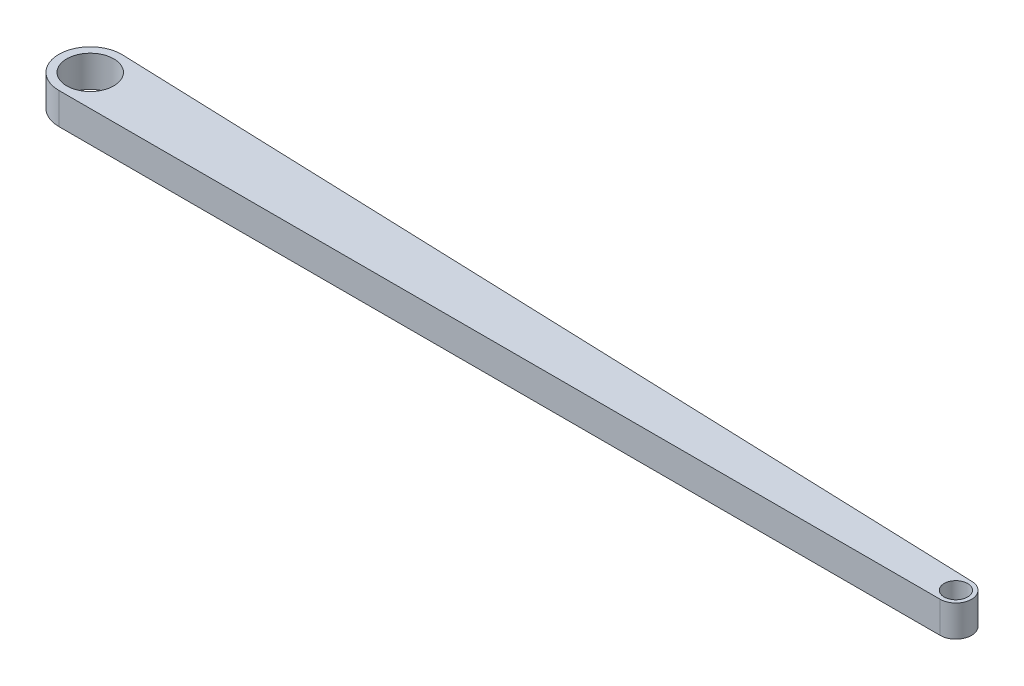
ISO-10303-21;
HEADER;
FILE_DESCRIPTION(('STEP AP214'),'2;1');
FILE_NAME('part.step','',(''),(''),'','','');
FILE_SCHEMA(('AUTOMOTIVE_DESIGN { 1 0 10303 214 1 1 1 1 }'));
ENDSEC;
DATA;
#1=APPLICATION_CONTEXT('core data for automotive mechanical design processes');
#2=APPLICATION_PROTOCOL_DEFINITION('international standard','automotive_design',2000,#1);
#3=PRODUCT_CONTEXT('',#1,'mechanical');
#4=PRODUCT('Part','Part','',(#3));
#5=PRODUCT_RELATED_PRODUCT_CATEGORY('part','',(#4));
#6=PRODUCT_DEFINITION_FORMATION('','',#4);
#7=PRODUCT_DEFINITION_CONTEXT('part definition',#1,'design');
#8=PRODUCT_DEFINITION('design','',#6,#7);
#9=PRODUCT_DEFINITION_SHAPE('','',#8);
#10=(LENGTH_UNIT() NAMED_UNIT(*) SI_UNIT(.MILLI.,.METRE.));
#11=(NAMED_UNIT(*) PLANE_ANGLE_UNIT() SI_UNIT($,.RADIAN.));
#12=(NAMED_UNIT(*) SI_UNIT($,.STERADIAN.) SOLID_ANGLE_UNIT());
#13=UNCERTAINTY_MEASURE_WITH_UNIT(LENGTH_MEASURE(1.E-05),#10,'distance_accuracy_value','');
#14=(GEOMETRIC_REPRESENTATION_CONTEXT(3) GLOBAL_UNCERTAINTY_ASSIGNED_CONTEXT((#13)) GLOBAL_UNIT_ASSIGNED_CONTEXT((#10,
#11,#12)) REPRESENTATION_CONTEXT('',''));
#15=CARTESIAN_POINT('',(0.,0.,0.));
#16=DIRECTION('',(0.,0.,1.));
#17=DIRECTION('',(1.,0.,0.));
#18=AXIS2_PLACEMENT_3D('',#15,#16,#17);
#19=CARTESIAN_POINT('',(1800.,64.,-32.));
#20=DIRECTION('',(0.,-1.,0.));
#21=DIRECTION('',(0.,0.,-1.));
#22=AXIS2_PLACEMENT_3D('',#19,#20,#21);
#23=CYLINDRICAL_SURFACE('',#22,31.9999999999999);
#24=CARTESIAN_POINT('',(1800.,0.,-32.));
#25=DIRECTION('',(0.,1.,0.));
#26=DIRECTION('',(0.,0.,1.));
#27=AXIS2_PLACEMENT_3D('',#24,#25,#26);
#28=CIRCLE('',#27,31.9999999999999);
#29=CARTESIAN_POINT('',(1800.,0.,0.));
#30=VERTEX_POINT('',#29);
#31=CARTESIAN_POINT('',(1800.,0.,-64.));
#32=VERTEX_POINT('',#31);
#33=EDGE_CURVE('E110',#30,#32,#28,.T.);
#34=ORIENTED_EDGE('',*,*,#33,.T.);
#35=DIRECTION('',(0.,-1.,0.));
#36=VECTOR('',#35,1.);
#37=CARTESIAN_POINT('',(1800.,64.,-64.));
#38=LINE('',#37,#36);
#39=CARTESIAN_POINT('',(1800.,64.,-64.));
#40=VERTEX_POINT('',#39);
#41=EDGE_CURVE('E11',#40,#32,#38,.T.);
#42=ORIENTED_EDGE('',*,*,#41,.F.);
#43=CARTESIAN_POINT('',(1800.,64.,-32.));
#44=DIRECTION('',(0.,1.,0.));
#45=DIRECTION('',(0.,0.,1.));
#46=AXIS2_PLACEMENT_3D('',#43,#44,#45);
#47=CIRCLE('',#46,31.9999999999999);
#48=CARTESIAN_POINT('',(1800.,64.,0.));
#49=VERTEX_POINT('',#48);
#50=EDGE_CURVE('E81',#49,#40,#47,.T.);
#51=ORIENTED_EDGE('',*,*,#50,.F.);
#52=DIRECTION('',(0.,-1.,0.));
#53=VECTOR('',#52,1.);
#54=CARTESIAN_POINT('',(1800.,64.,0.));
#55=LINE('',#54,#53);
#56=EDGE_CURVE('E109',#49,#30,#55,.T.);
#57=ORIENTED_EDGE('',*,*,#56,.T.);
#58=EDGE_LOOP('',(#34,#42,#51,#57));
#59=FACE_BOUND('',#58,.T.);
#60=ADVANCED_FACE('F39',(#59),#23,.T.);
#61=CARTESIAN_POINT('',(4.54536487206297,64.,-127.838387026771));
#62=DIRECTION('',(0.0355331022196321,0.,-0.999368499927153));
#63=DIRECTION('',(-0.999368499927154,0.,-0.0355331022196321));
#64=AXIS2_PLACEMENT_3D('',#61,#62,#63);
#65=PLANE('',#64);
#66=DIRECTION('',(0.999368499927154,0.,0.0355331022196321));
#67=VECTOR('',#66,1.);
#68=CARTESIAN_POINT('',(4.54536487206297,0.,-127.838387026771));
#69=LINE('',#68,#67);
#70=CARTESIAN_POINT('',(0.,0.,-128.));
#71=VERTEX_POINT('',#70);
#72=EDGE_CURVE('E91',#71,#32,#69,.T.);
#73=ORIENTED_EDGE('',*,*,#72,.F.);
#74=DIRECTION('',(0.,-1.,0.));
#75=VECTOR('',#74,1.);
#76=CARTESIAN_POINT('',(0.,64.,-128.));
#77=LINE('',#76,#75);
#78=CARTESIAN_POINT('',(0.,64.,-128.));
#79=VERTEX_POINT('',#78);
#80=EDGE_CURVE('E47',#79,#71,#77,.T.);
#81=ORIENTED_EDGE('',*,*,#80,.F.);
#82=DIRECTION('',(0.999368499927154,0.,0.0355331022196321));
#83=VECTOR('',#82,1.);
#84=CARTESIAN_POINT('',(4.54536487206297,64.,-127.838387026771));
#85=LINE('',#84,#83);
#86=EDGE_CURVE('E89',#79,#40,#85,.T.);
#87=ORIENTED_EDGE('',*,*,#86,.T.);
#88=ORIENTED_EDGE('',*,*,#41,.T.);
#89=EDGE_LOOP('',(#73,#81,#87,#88));
#90=FACE_BOUND('',#89,.T.);
#91=ADVANCED_FACE('F88',(#90),#65,.T.);
#92=CARTESIAN_POINT('',(0.,64.,-64.));
#93=DIRECTION('',(0.,-1.,0.));
#94=DIRECTION('',(0.,0.,-1.));
#95=AXIS2_PLACEMENT_3D('',#92,#93,#94);
#96=CYLINDRICAL_SURFACE('',#95,64.);
#97=CARTESIAN_POINT('',(0.,0.,-64.));
#98=DIRECTION('',(0.,1.,0.));
#99=DIRECTION('',(0.,0.,1.));
#100=AXIS2_PLACEMENT_3D('',#97,#98,#99);
#101=CIRCLE('',#100,64.);
#102=CARTESIAN_POINT('',(0.,0.,0.));
#103=VERTEX_POINT('',#102);
#104=EDGE_CURVE('E70',#71,#103,#101,.T.);
#105=ORIENTED_EDGE('',*,*,#104,.T.);
#106=DIRECTION('',(0.,-1.,0.));
#107=VECTOR('',#106,1.);
#108=CARTESIAN_POINT('',(0.,64.,0.));
#109=LINE('',#108,#107);
#110=CARTESIAN_POINT('',(0.,64.,0.));
#111=VERTEX_POINT('',#110);
#112=EDGE_CURVE('E92',#111,#103,#109,.T.);
#113=ORIENTED_EDGE('',*,*,#112,.F.);
#114=CARTESIAN_POINT('',(0.,64.,-64.));
#115=DIRECTION('',(0.,1.,0.));
#116=DIRECTION('',(0.,0.,1.));
#117=AXIS2_PLACEMENT_3D('',#114,#115,#116);
#118=CIRCLE('',#117,64.);
#119=EDGE_CURVE('E93',#79,#111,#118,.T.);
#120=ORIENTED_EDGE('',*,*,#119,.F.);
#121=ORIENTED_EDGE('',*,*,#80,.T.);
#122=EDGE_LOOP('',(#105,#113,#120,#121));
#123=FACE_BOUND('',#122,.T.);
#124=ADVANCED_FACE('F94',(#123),#96,.T.);
#125=CARTESIAN_POINT('',(0.,64.,-64.));
#126=DIRECTION('',(0.,-1.,0.));
#127=DIRECTION('',(0.,0.,-1.));
#128=AXIS2_PLACEMENT_3D('',#125,#126,#127);
#129=CYLINDRICAL_SURFACE('',#128,48.);
#130=CARTESIAN_POINT('',(0.,64.,-64.));
#131=DIRECTION('',(0.,1.,0.));
#132=DIRECTION('',(0.,0.,1.));
#133=AXIS2_PLACEMENT_3D('',#130,#131,#132);
#134=CIRCLE('',#133,48.);
#135=CARTESIAN_POINT('',(0.,64.,-16.));
#136=VERTEX_POINT('',#135);
#137=EDGE_CURVE('E103',#136,#136,#134,.T.);
#138=ORIENTED_EDGE('',*,*,#137,.T.);
#139=EDGE_LOOP('',(#138));
#140=FACE_BOUND('',#139,.T.);
#141=CARTESIAN_POINT('',(0.,0.,-64.));
#142=DIRECTION('',(0.,1.,0.));
#143=DIRECTION('',(0.,0.,1.));
#144=AXIS2_PLACEMENT_3D('',#141,#142,#143);
#145=CIRCLE('',#144,48.);
#146=CARTESIAN_POINT('',(0.,0.,-16.));
#147=VERTEX_POINT('',#146);
#148=EDGE_CURVE('E116',#147,#147,#145,.T.);
#149=ORIENTED_EDGE('',*,*,#148,.F.);
#150=EDGE_LOOP('',(#149));
#151=FACE_BOUND('',#150,.T.);
#152=ADVANCED_FACE('F135',(#140,#151),#129,.F.);
#153=CARTESIAN_POINT('',(0.,64.,0.));
#154=DIRECTION('',(0.,0.,-1.));
#155=DIRECTION('',(-1.,0.,0.));
#156=AXIS2_PLACEMENT_3D('',#153,#154,#155);
#157=PLANE('',#156);
#158=DIRECTION('',(1.,0.,0.));
#159=VECTOR('',#158,1.);
#160=CARTESIAN_POINT('',(0.,0.,0.));
#161=LINE('',#160,#159);
#162=EDGE_CURVE('E76',#103,#30,#161,.T.);
#163=ORIENTED_EDGE('',*,*,#162,.T.);
#164=ORIENTED_EDGE('',*,*,#56,.F.);
#165=DIRECTION('',(1.,0.,0.));
#166=VECTOR('',#165,1.);
#167=CARTESIAN_POINT('',(0.,64.,0.));
#168=LINE('',#167,#166);
#169=EDGE_CURVE('E55',#111,#49,#168,.T.);
#170=ORIENTED_EDGE('',*,*,#169,.F.);
#171=ORIENTED_EDGE('',*,*,#112,.T.);
#172=EDGE_LOOP('',(#163,#164,#170,#171));
#173=FACE_BOUND('',#172,.T.);
#174=ADVANCED_FACE('F122',(#173),#157,.F.);
#175=CARTESIAN_POINT('',(1800.,64.,-32.));
#176=DIRECTION('',(0.,-1.,0.));
#177=DIRECTION('',(0.,0.,-1.));
#178=AXIS2_PLACEMENT_3D('',#175,#176,#177);
#179=CYLINDRICAL_SURFACE('',#178,24.);
#180=CARTESIAN_POINT('',(1800.,64.,-32.));
#181=DIRECTION('',(0.,1.,0.));
#182=DIRECTION('',(0.,0.,1.));
#183=AXIS2_PLACEMENT_3D('',#180,#181,#182);
#184=CIRCLE('',#183,24.);
#185=CARTESIAN_POINT('',(1800.,64.,-8.00000000000004));
#186=VERTEX_POINT('',#185);
#187=EDGE_CURVE('E106',#186,#186,#184,.T.);
#188=ORIENTED_EDGE('',*,*,#187,.T.);
#189=EDGE_LOOP('',(#188));
#190=FACE_BOUND('',#189,.T.);
#191=CARTESIAN_POINT('',(1800.,0.,-32.));
#192=DIRECTION('',(0.,1.,0.));
#193=DIRECTION('',(0.,0.,1.));
#194=AXIS2_PLACEMENT_3D('',#191,#192,#193);
#195=CIRCLE('',#194,24.);
#196=CARTESIAN_POINT('',(1800.,0.,-8.00000000000004));
#197=VERTEX_POINT('',#196);
#198=EDGE_CURVE('E99',#197,#197,#195,.T.);
#199=ORIENTED_EDGE('',*,*,#198,.F.);
#200=EDGE_LOOP('',(#199));
#201=FACE_BOUND('',#200,.T.);
#202=ADVANCED_FACE('F140',(#190,#201),#179,.F.);
#203=CARTESIAN_POINT('',(0.,64.,0.));
#204=DIRECTION('',(0.,1.,0.));
#205=DIRECTION('',(0.,0.,1.));
#206=AXIS2_PLACEMENT_3D('',#203,#204,#205);
#207=PLANE('',#206);
#208=ORIENTED_EDGE('',*,*,#50,.T.);
#209=ORIENTED_EDGE('',*,*,#86,.F.);
#210=ORIENTED_EDGE('',*,*,#119,.T.);
#211=ORIENTED_EDGE('',*,*,#169,.T.);
#212=EDGE_LOOP('',(#208,#209,#210,#211));
#213=FACE_BOUND('',#212,.T.);
#214=ORIENTED_EDGE('',*,*,#137,.F.);
#215=EDGE_LOOP('',(#214));
#216=FACE_BOUND('',#215,.T.);
#217=ORIENTED_EDGE('',*,*,#187,.F.);
#218=EDGE_LOOP('',(#217));
#219=FACE_BOUND('',#218,.T.);
#220=ADVANCED_FACE('F96',(#213,#216,#219),#207,.T.);
#221=CARTESIAN_POINT('',(0.,0.,0.));
#222=DIRECTION('',(0.,1.,0.));
#223=DIRECTION('',(0.,0.,1.));
#224=AXIS2_PLACEMENT_3D('',#221,#222,#223);
#225=PLANE('',#224);
#226=ORIENTED_EDGE('',*,*,#33,.F.);
#227=ORIENTED_EDGE('',*,*,#162,.F.);
#228=ORIENTED_EDGE('',*,*,#104,.F.);
#229=ORIENTED_EDGE('',*,*,#72,.T.);
#230=EDGE_LOOP('',(#226,#227,#228,#229));
#231=FACE_BOUND('',#230,.T.);
#232=ORIENTED_EDGE('',*,*,#148,.T.);
#233=EDGE_LOOP('',(#232));
#234=FACE_BOUND('',#233,.T.);
#235=ORIENTED_EDGE('',*,*,#198,.T.);
#236=EDGE_LOOP('',(#235));
#237=FACE_BOUND('',#236,.T.);
#238=ADVANCED_FACE('F125',(#231,#234,#237),#225,.F.);
#239=CLOSED_SHELL('',(#60,#91,#124,#152,#174,#202,#220,#238));
#240=MANIFOLD_SOLID_BREP('B2',#239);
#241=ADVANCED_BREP_SHAPE_REPRESENTATION('',(#18,#240),#14);
#242=SHAPE_DEFINITION_REPRESENTATION(#9,#241);
ENDSEC;
END-ISO-10303-21;
